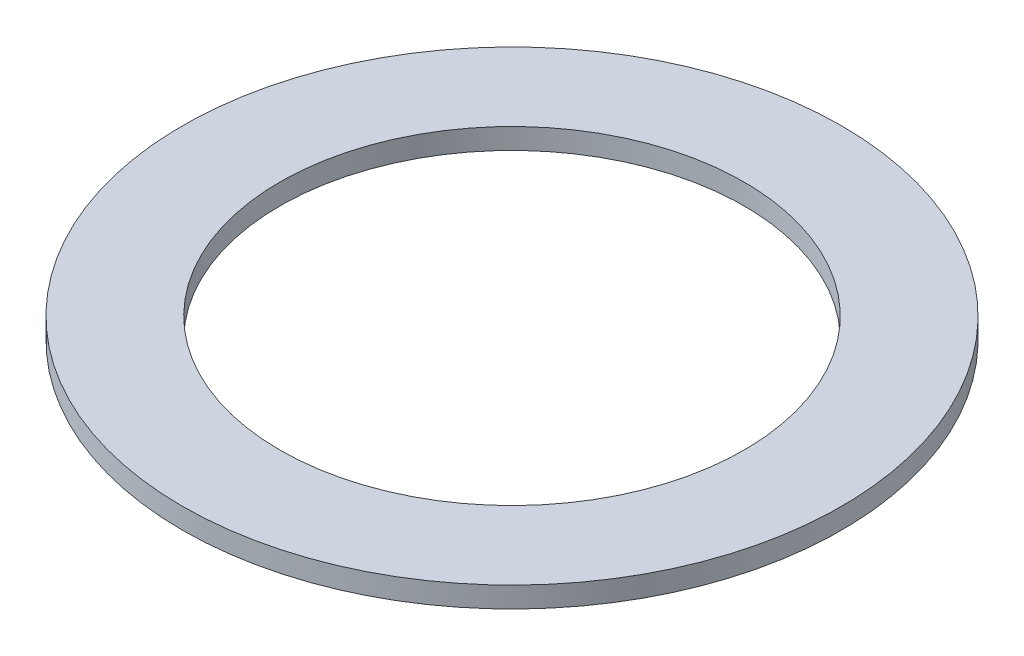
ISO-10303-21;
HEADER;
FILE_DESCRIPTION(('STEP AP214'),'2;1');
FILE_NAME('part.step','',(''),(''),'','','');
FILE_SCHEMA(('AUTOMOTIVE_DESIGN { 1 0 10303 214 1 1 1 1 }'));
ENDSEC;
DATA;
#1=APPLICATION_CONTEXT('core data for automotive mechanical design processes');
#2=APPLICATION_PROTOCOL_DEFINITION('international standard','automotive_design',2000,#1);
#3=PRODUCT_CONTEXT('',#1,'mechanical');
#4=PRODUCT('Part','Part','',(#3));
#5=PRODUCT_RELATED_PRODUCT_CATEGORY('part','',(#4));
#6=PRODUCT_DEFINITION_FORMATION('','',#4);
#7=PRODUCT_DEFINITION_CONTEXT('part definition',#1,'design');
#8=PRODUCT_DEFINITION('design','',#6,#7);
#9=PRODUCT_DEFINITION_SHAPE('','',#8);
#10=(LENGTH_UNIT() NAMED_UNIT(*) SI_UNIT(.MILLI.,.METRE.));
#11=(NAMED_UNIT(*) PLANE_ANGLE_UNIT() SI_UNIT($,.RADIAN.));
#12=(NAMED_UNIT(*) SI_UNIT($,.STERADIAN.) SOLID_ANGLE_UNIT());
#13=UNCERTAINTY_MEASURE_WITH_UNIT(LENGTH_MEASURE(1.E-05),#10,'distance_accuracy_value','');
#14=(GEOMETRIC_REPRESENTATION_CONTEXT(3) GLOBAL_UNCERTAINTY_ASSIGNED_CONTEXT((#13)) GLOBAL_UNIT_ASSIGNED_CONTEXT((#10,
#11,#12)) REPRESENTATION_CONTEXT('',''));
#15=CARTESIAN_POINT('',(0.,0.,0.));
#16=DIRECTION('',(0.,0.,1.));
#17=DIRECTION('',(1.,0.,0.));
#18=AXIS2_PLACEMENT_3D('',#15,#16,#17);
#19=CARTESIAN_POINT('',(0.,0.5,0.));
#20=DIRECTION('',(0.,1.,0.));
#21=DIRECTION('',(0.,0.,1.));
#22=AXIS2_PLACEMENT_3D('',#19,#20,#21);
#23=PLANE('',#22);
#24=CARTESIAN_POINT('',(0.,0.5,0.));
#25=DIRECTION('',(0.,1.,0.));
#26=DIRECTION('',(0.,0.,1.));
#27=AXIS2_PLACEMENT_3D('',#24,#25,#26);
#28=CIRCLE('',#27,7.95);
#29=CARTESIAN_POINT('',(0.,0.5,7.95));
#30=VERTEX_POINT('',#29);
#31=EDGE_CURVE('E10',#30,#30,#28,.T.);
#32=ORIENTED_EDGE('',*,*,#31,.T.);
#33=EDGE_LOOP('',(#32));
#34=FACE_BOUND('',#33,.T.);
#35=CARTESIAN_POINT('',(0.,0.5,0.));
#36=DIRECTION('',(0.,1.,0.));
#37=DIRECTION('',(0.,0.,1.));
#38=AXIS2_PLACEMENT_3D('',#35,#36,#37);
#39=CIRCLE('',#38,5.6);
#40=CARTESIAN_POINT('',(0.,0.5,5.6));
#41=VERTEX_POINT('',#40);
#42=EDGE_CURVE('E44',#41,#41,#39,.T.);
#43=ORIENTED_EDGE('',*,*,#42,.F.);
#44=EDGE_LOOP('',(#43));
#45=FACE_BOUND('',#44,.T.);
#46=ADVANCED_FACE('F33',(#34,#45),#23,.T.);
#47=CARTESIAN_POINT('',(0.,0.,0.));
#48=DIRECTION('',(0.,1.,0.));
#49=DIRECTION('',(0.,0.,1.));
#50=AXIS2_PLACEMENT_3D('',#47,#48,#49);
#51=PLANE('',#50);
#52=CARTESIAN_POINT('',(0.,0.,0.));
#53=DIRECTION('',(0.,1.,0.));
#54=DIRECTION('',(0.,0.,1.));
#55=AXIS2_PLACEMENT_3D('',#52,#53,#54);
#56=CIRCLE('',#55,7.95);
#57=CARTESIAN_POINT('',(0.,0.,7.95));
#58=VERTEX_POINT('',#57);
#59=EDGE_CURVE('E37',#58,#58,#56,.T.);
#60=ORIENTED_EDGE('',*,*,#59,.F.);
#61=EDGE_LOOP('',(#60));
#62=FACE_BOUND('',#61,.T.);
#63=CARTESIAN_POINT('',(0.,0.,0.));
#64=DIRECTION('',(0.,1.,0.));
#65=DIRECTION('',(0.,0.,1.));
#66=AXIS2_PLACEMENT_3D('',#63,#64,#65);
#67=CIRCLE('',#66,5.6);
#68=CARTESIAN_POINT('',(0.,0.,5.6));
#69=VERTEX_POINT('',#68);
#70=EDGE_CURVE('E46',#69,#69,#67,.T.);
#71=ORIENTED_EDGE('',*,*,#70,.T.);
#72=EDGE_LOOP('',(#71));
#73=FACE_BOUND('',#72,.T.);
#74=ADVANCED_FACE('F56',(#62,#73),#51,.F.);
#75=CARTESIAN_POINT('',(0.,0.5,0.));
#76=DIRECTION('',(0.,-1.,0.));
#77=DIRECTION('',(0.,0.,-1.));
#78=AXIS2_PLACEMENT_3D('',#75,#76,#77);
#79=CYLINDRICAL_SURFACE('',#78,7.95);
#80=ORIENTED_EDGE('',*,*,#31,.F.);
#81=EDGE_LOOP('',(#80));
#82=FACE_BOUND('',#81,.T.);
#83=ORIENTED_EDGE('',*,*,#59,.T.);
#84=EDGE_LOOP('',(#83));
#85=FACE_BOUND('',#84,.T.);
#86=ADVANCED_FACE('F35',(#82,#85),#79,.T.);
#87=CARTESIAN_POINT('',(0.,0.5,0.));
#88=DIRECTION('',(0.,-1.,0.));
#89=DIRECTION('',(0.,0.,-1.));
#90=AXIS2_PLACEMENT_3D('',#87,#88,#89);
#91=CYLINDRICAL_SURFACE('',#90,5.6);
#92=ORIENTED_EDGE('',*,*,#42,.T.);
#93=EDGE_LOOP('',(#92));
#94=FACE_BOUND('',#93,.T.);
#95=ORIENTED_EDGE('',*,*,#70,.F.);
#96=EDGE_LOOP('',(#95));
#97=FACE_BOUND('',#96,.T.);
#98=ADVANCED_FACE('F52',(#94,#97),#91,.F.);
#99=CLOSED_SHELL('',(#46,#74,#86,#98));
#100=MANIFOLD_SOLID_BREP('B2',#99);
#101=ADVANCED_BREP_SHAPE_REPRESENTATION('',(#18,#100),#14);
#102=SHAPE_DEFINITION_REPRESENTATION(#9,#101);
ENDSEC;
END-ISO-10303-21;
